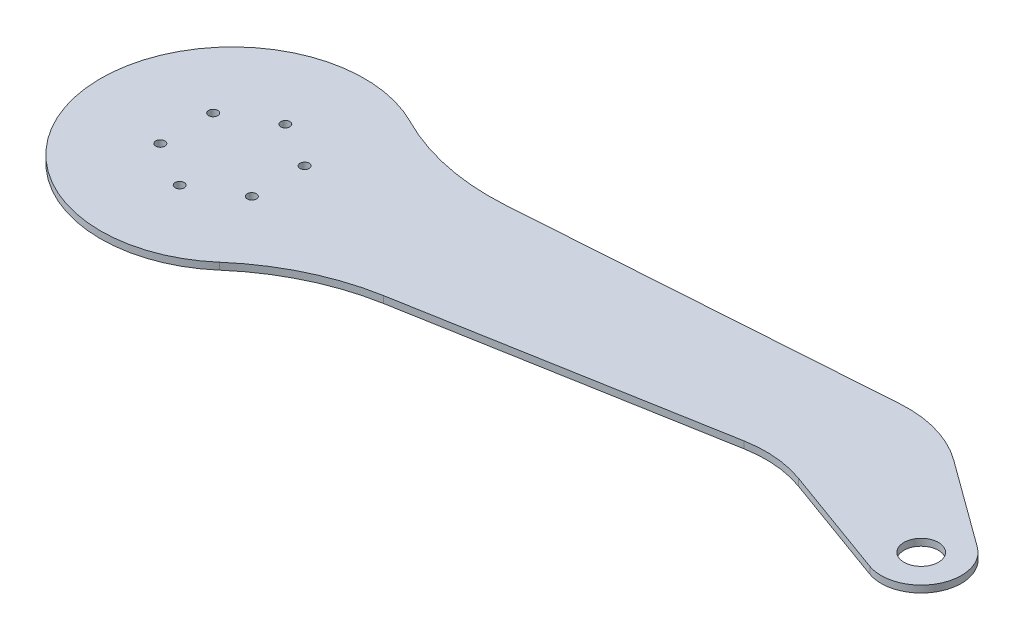
ISO-10303-21;
HEADER;
FILE_DESCRIPTION(('STEP AP214'),'2;1');
FILE_NAME('part.step','',(''),(''),'','','');
FILE_SCHEMA(('AUTOMOTIVE_DESIGN { 1 0 10303 214 1 1 1 1 }'));
ENDSEC;
DATA;
#1=APPLICATION_CONTEXT('core data for automotive mechanical design processes');
#2=APPLICATION_PROTOCOL_DEFINITION('international standard','automotive_design',2000,#1);
#3=PRODUCT_CONTEXT('',#1,'mechanical');
#4=PRODUCT('Part','Part','',(#3));
#5=PRODUCT_RELATED_PRODUCT_CATEGORY('part','',(#4));
#6=PRODUCT_DEFINITION_FORMATION('','',#4);
#7=PRODUCT_DEFINITION_CONTEXT('part definition',#1,'design');
#8=PRODUCT_DEFINITION('design','',#6,#7);
#9=PRODUCT_DEFINITION_SHAPE('','',#8);
#10=(LENGTH_UNIT() NAMED_UNIT(*) SI_UNIT(.MILLI.,.METRE.));
#11=(NAMED_UNIT(*) PLANE_ANGLE_UNIT() SI_UNIT($,.RADIAN.));
#12=(NAMED_UNIT(*) SI_UNIT($,.STERADIAN.) SOLID_ANGLE_UNIT());
#13=UNCERTAINTY_MEASURE_WITH_UNIT(LENGTH_MEASURE(1.E-05),#10,'distance_accuracy_value','');
#14=(GEOMETRIC_REPRESENTATION_CONTEXT(3) GLOBAL_UNCERTAINTY_ASSIGNED_CONTEXT((#13)) GLOBAL_UNIT_ASSIGNED_CONTEXT((#10,
#11,#12)) REPRESENTATION_CONTEXT('',''));
#15=CARTESIAN_POINT('',(0.,0.,0.));
#16=DIRECTION('',(0.,0.,1.));
#17=DIRECTION('',(1.,0.,0.));
#18=AXIS2_PLACEMENT_3D('',#15,#16,#17);
#19=CARTESIAN_POINT('',(28.8662620660002,3.,-79.6494584805988));
#20=DIRECTION('',(-0.340729771025605,0.,0.940161275067655));
#21=DIRECTION('',(0.940161275067655,0.,0.340729771025605));
#22=AXIS2_PLACEMENT_3D('',#19,#20,#21);
#23=PLANE('',#22);
#24=DIRECTION('',(-0.940161275067655,0.,-0.340729771025605));
#25=VECTOR('',#24,1.);
#26=CARTESIAN_POINT('',(28.8662620660002,3.,-79.6494584805988));
#27=LINE('',#26,#25);
#28=CARTESIAN_POINT('',(294.037229007052,3.,16.4528223136839));
#29=VERTEX_POINT('',#28);
#30=CARTESIAN_POINT('',(245.23023292495,3.,-1.23562863671853));
#31=VERTEX_POINT('',#30);
#32=EDGE_CURVE('E113',#29,#31,#27,.T.);
#33=ORIENTED_EDGE('',*,*,#32,.T.);
#34=DIRECTION('',(0.,-1.,0.));
#35=VECTOR('',#34,1.);
#36=CARTESIAN_POINT('',(245.23023292495,0.,-1.2356286367185));
#37=LINE('',#36,#35);
#38=CARTESIAN_POINT('',(245.23023292495,0.,-1.23562863671853));
#39=VERTEX_POINT('',#38);
#40=EDGE_CURVE('E213',#31,#39,#37,.T.);
#41=ORIENTED_EDGE('',*,*,#40,.T.);
#42=DIRECTION('',(-0.940161275067655,0.,-0.340729771025605));
#43=VECTOR('',#42,1.);
#44=CARTESIAN_POINT('',(28.8662620660002,0.,-79.6494584805988));
#45=LINE('',#44,#43);
#46=CARTESIAN_POINT('',(294.037229007052,0.,16.4528223136839));
#47=VERTEX_POINT('',#46);
#48=EDGE_CURVE('E116',#47,#39,#45,.T.);
#49=ORIENTED_EDGE('',*,*,#48,.F.);
#50=DIRECTION('',(0.,-1.,0.));
#51=VECTOR('',#50,1.);
#52=CARTESIAN_POINT('',(294.037229007052,3.,16.4528223136839));
#53=LINE('',#52,#51);
#54=EDGE_CURVE('E109',#29,#47,#53,.T.);
#55=ORIENTED_EDGE('',*,*,#54,.F.);
#56=EDGE_LOOP('',(#33,#41,#49,#55));
#57=FACE_BOUND('',#56,.T.);
#58=ADVANCED_FACE('F34',(#57),#23,.T.);
#59=CARTESIAN_POINT('',(300.,3.,0.));
#60=DIRECTION('',(0.,-1.,0.));
#61=DIRECTION('',(0.,0.,-1.));
#62=AXIS2_PLACEMENT_3D('',#59,#60,#61);
#63=CYLINDRICAL_SURFACE('',#62,17.5);
#64=CARTESIAN_POINT('',(300.,0.,0.));
#65=DIRECTION('',(0.,1.,0.));
#66=DIRECTION('',(0.,0.,1.));
#67=AXIS2_PLACEMENT_3D('',#64,#65,#66);
#68=CIRCLE('',#67,17.5);
#69=CARTESIAN_POINT('',(310.311776158135,0.,-14.1392104611441));
#70=VERTEX_POINT('',#69);
#71=EDGE_CURVE('E173',#47,#70,#68,.T.);
#72=ORIENTED_EDGE('',*,*,#71,.T.);
#73=DIRECTION('',(0.,-1.,0.));
#74=VECTOR('',#73,1.);
#75=CARTESIAN_POINT('',(310.311776158135,3.,-14.1392104611441));
#76=LINE('',#75,#74);
#77=CARTESIAN_POINT('',(310.311776158135,3.,-14.1392104611441));
#78=VERTEX_POINT('',#77);
#79=EDGE_CURVE('E120',#78,#70,#76,.T.);
#80=ORIENTED_EDGE('',*,*,#79,.F.);
#81=CARTESIAN_POINT('',(300.,3.,0.));
#82=DIRECTION('',(0.,1.,0.));
#83=DIRECTION('',(0.,0.,1.));
#84=AXIS2_PLACEMENT_3D('',#81,#82,#83);
#85=CIRCLE('',#84,17.5);
#86=EDGE_CURVE('E123',#29,#78,#85,.T.);
#87=ORIENTED_EDGE('',*,*,#86,.F.);
#88=ORIENTED_EDGE('',*,*,#54,.T.);
#89=EDGE_LOOP('',(#72,#80,#87,#88));
#90=FACE_BOUND('',#89,.T.);
#91=ADVANCED_FACE('F124',(#90),#63,.T.);
#92=CARTESIAN_POINT('',(114.474448029618,3.,-156.964065966195));
#93=DIRECTION('',(-0.589244351893404,0.,0.80795488349395));
#94=DIRECTION('',(0.80795488349395,0.,0.589244351893404));
#95=AXIS2_PLACEMENT_3D('',#92,#93,#94);
#96=PLANE('',#95);
#97=DIRECTION('',(-0.80795488349395,0.,-0.589244351893404));
#98=VECTOR('',#97,1.);
#99=CARTESIAN_POINT('',(114.474448029618,0.,-156.964065966195));
#100=LINE('',#99,#98);
#101=CARTESIAN_POINT('',(272.247100749326,0.,-41.8999127596457));
#102=VERTEX_POINT('',#101);
#103=EDGE_CURVE('E175',#70,#102,#100,.T.);
#104=ORIENTED_EDGE('',*,*,#103,.T.);
#105=DIRECTION('',(0.,-1.,0.));
#106=VECTOR('',#105,1.);
#107=CARTESIAN_POINT('',(272.247100749326,3.,-41.8999127596458));
#108=LINE('',#107,#106);
#109=CARTESIAN_POINT('',(272.247100749326,3.,-41.8999127596457));
#110=VERTEX_POINT('',#109);
#111=EDGE_CURVE('E208',#102,#110,#108,.F.);
#112=ORIENTED_EDGE('',*,*,#111,.T.);
#113=DIRECTION('',(-0.80795488349395,0.,-0.589244351893404));
#114=VECTOR('',#113,1.);
#115=CARTESIAN_POINT('',(114.474448029618,3.,-156.964065966195));
#116=LINE('',#115,#114);
#117=EDGE_CURVE('E129',#78,#110,#116,.T.);
#118=ORIENTED_EDGE('',*,*,#117,.F.);
#119=ORIENTED_EDGE('',*,*,#79,.T.);
#120=EDGE_LOOP('',(#104,#112,#118,#119));
#121=FACE_BOUND('',#120,.T.);
#122=ADVANCED_FACE('F258',(#121),#96,.F.);
#123=CARTESIAN_POINT('',(-2.37846094109579,3.,-34.9190911043183));
#124=DIRECTION('',(-0.0679560268884512,0.,-0.997688317266237));
#125=DIRECTION('',(-0.997688317266237,0.,0.0679560268884512));
#126=AXIS2_PLACEMENT_3D('',#123,#124,#125);
#127=PLANE('',#126);
#128=DIRECTION('',(0.997688317266237,0.,-0.0679560268884512));
#129=VECTOR('',#128,1.);
#130=CARTESIAN_POINT('',(-2.37846094109579,0.,-34.9190911043183));
#131=LINE('',#130,#129);
#132=CARTESIAN_POINT('',(78.5589077176873,0.,-40.4320172413385));
#133=VERTEX_POINT('',#132);
#134=CARTESIAN_POINT('',(239.387081810233,0.,-51.3865844482602));
#135=VERTEX_POINT('',#134);
#136=EDGE_CURVE('E178',#133,#135,#131,.T.);
#137=ORIENTED_EDGE('',*,*,#136,.F.);
#138=DIRECTION('',(0.,-1.,0.));
#139=VECTOR('',#138,1.);
#140=CARTESIAN_POINT('',(78.5589077176873,3.,-40.4320172413385));
#141=LINE('',#140,#139);
#142=CARTESIAN_POINT('',(78.5589077176873,3.,-40.4320172413385));
#143=VERTEX_POINT('',#142);
#144=EDGE_CURVE('E55',#133,#143,#141,.F.);
#145=ORIENTED_EDGE('',*,*,#144,.T.);
#146=DIRECTION('',(0.997688317266237,0.,-0.0679560268884512));
#147=VECTOR('',#146,1.);
#148=CARTESIAN_POINT('',(-2.37846094109579,3.,-34.9190911043183));
#149=LINE('',#148,#147);
#150=CARTESIAN_POINT('',(239.387081810233,3.,-51.3865844482602));
#151=VERTEX_POINT('',#150);
#152=EDGE_CURVE('E143',#143,#151,#149,.T.);
#153=ORIENTED_EDGE('',*,*,#152,.T.);
#154=DIRECTION('',(0.,-1.,0.));
#155=VECTOR('',#154,1.);
#156=CARTESIAN_POINT('',(239.387081810233,0.,-51.3865844482602));
#157=LINE('',#156,#155);
#158=EDGE_CURVE('E119',#151,#135,#157,.T.);
#159=ORIENTED_EDGE('',*,*,#158,.T.);
#160=EDGE_LOOP('',(#137,#145,#153,#159));
#161=FACE_BOUND('',#160,.T.);
#162=ADVANCED_FACE('F251',(#161),#127,.T.);
#163=CARTESIAN_POINT('',(0.,3.,0.));
#164=DIRECTION('',(0.,-1.,0.));
#165=DIRECTION('',(0.,0.,-1.));
#166=AXIS2_PLACEMENT_3D('',#163,#164,#165);
#167=CYLINDRICAL_SURFACE('',#166,57.5);
#168=CARTESIAN_POINT('',(0.,0.,0.));
#169=DIRECTION('',(0.,1.,0.));
#170=DIRECTION('',(0.,0.,1.));
#171=AXIS2_PLACEMENT_3D('',#168,#169,#170);
#172=CIRCLE('',#171,57.5);
#173=CARTESIAN_POINT('',(26.1993018359265,0.,-51.1844369248116));
#174=VERTEX_POINT('',#173);
#175=CARTESIAN_POINT('',(37.7849911882178,0.,43.3421785436116));
#176=VERTEX_POINT('',#175);
#177=EDGE_CURVE('E180',#174,#176,#172,.T.);
#178=ORIENTED_EDGE('',*,*,#177,.T.);
#179=DIRECTION('',(0.,-1.,0.));
#180=VECTOR('',#179,1.);
#181=CARTESIAN_POINT('',(37.7849911882178,3.,43.3421785436116));
#182=LINE('',#181,#180);
#183=CARTESIAN_POINT('',(37.7849911882178,3.,43.3421785436116));
#184=VERTEX_POINT('',#183);
#185=EDGE_CURVE('E226',#176,#184,#182,.F.);
#186=ORIENTED_EDGE('',*,*,#185,.T.);
#187=CARTESIAN_POINT('',(0.,3.,0.));
#188=DIRECTION('',(0.,1.,0.));
#189=DIRECTION('',(0.,0.,1.));
#190=AXIS2_PLACEMENT_3D('',#187,#188,#189);
#191=CIRCLE('',#190,57.5);
#192=CARTESIAN_POINT('',(26.1993018359265,3.,-51.1844369248116));
#193=VERTEX_POINT('',#192);
#194=EDGE_CURVE('E145',#193,#184,#191,.T.);
#195=ORIENTED_EDGE('',*,*,#194,.F.);
#196=DIRECTION('',(0.,-1.,0.));
#197=VECTOR('',#196,1.);
#198=CARTESIAN_POINT('',(26.1993018359265,3.,-51.1844369248116));
#199=LINE('',#198,#197);
#200=EDGE_CURVE('E223',#193,#174,#199,.T.);
#201=ORIENTED_EDGE('',*,*,#200,.T.);
#202=EDGE_LOOP('',(#178,#186,#195,#201));
#203=FACE_BOUND('',#202,.T.);
#204=ADVANCED_FACE('F245',(#203),#167,.T.);
#205=CARTESIAN_POINT('',(-19.9185842870416,3.,-11.4999999999991));
#206=DIRECTION('',(0.,-1.,0.));
#207=DIRECTION('',(0.,0.,-1.));
#208=AXIS2_PLACEMENT_3D('',#205,#206,#207);
#209=CYLINDRICAL_SURFACE('',#208,2.);
#210=CARTESIAN_POINT('',(-19.9185842870416,3.,-11.4999999999991));
#211=DIRECTION('',(0.,1.,0.));
#212=DIRECTION('',(0.,0.,1.));
#213=AXIS2_PLACEMENT_3D('',#210,#211,#212);
#214=CIRCLE('',#213,2.);
#215=CARTESIAN_POINT('',(-19.9185842870416,3.,-9.49999999999914));
#216=VERTEX_POINT('',#215);
#217=EDGE_CURVE('E166',#216,#216,#214,.T.);
#218=ORIENTED_EDGE('',*,*,#217,.T.);
#219=EDGE_LOOP('',(#218));
#220=FACE_BOUND('',#219,.T.);
#221=CARTESIAN_POINT('',(-19.9185842870416,0.,-11.4999999999991));
#222=DIRECTION('',(0.,1.,0.));
#223=DIRECTION('',(0.,0.,1.));
#224=AXIS2_PLACEMENT_3D('',#221,#222,#223);
#225=CIRCLE('',#224,2.);
#226=CARTESIAN_POINT('',(-19.9185842870416,0.,-9.49999999999914));
#227=VERTEX_POINT('',#226);
#228=EDGE_CURVE('E139',#227,#227,#225,.T.);
#229=ORIENTED_EDGE('',*,*,#228,.F.);
#230=EDGE_LOOP('',(#229));
#231=FACE_BOUND('',#230,.T.);
#232=ADVANCED_FACE('F331',(#220,#231),#209,.F.);
#233=CARTESIAN_POINT('',(-19.9185842870421,3.,11.5));
#234=DIRECTION('',(0.,-1.,0.));
#235=DIRECTION('',(0.,0.,-1.));
#236=AXIS2_PLACEMENT_3D('',#233,#234,#235);
#237=CYLINDRICAL_SURFACE('',#236,2.00000000000115);
#238=CARTESIAN_POINT('',(-19.9185842870421,3.,11.5));
#239=DIRECTION('',(0.,1.,0.));
#240=DIRECTION('',(0.,0.,1.));
#241=AXIS2_PLACEMENT_3D('',#238,#239,#240);
#242=CIRCLE('',#241,2.00000000000115);
#243=CARTESIAN_POINT('',(-19.9185842870421,3.,13.5000000000012));
#244=VERTEX_POINT('',#243);
#245=EDGE_CURVE('E163',#244,#244,#242,.T.);
#246=ORIENTED_EDGE('',*,*,#245,.T.);
#247=EDGE_LOOP('',(#246));
#248=FACE_BOUND('',#247,.T.);
#249=CARTESIAN_POINT('',(-19.9185842870421,0.,11.5));
#250=DIRECTION('',(0.,1.,0.));
#251=DIRECTION('',(0.,0.,1.));
#252=AXIS2_PLACEMENT_3D('',#249,#250,#251);
#253=CIRCLE('',#252,2.00000000000115);
#254=CARTESIAN_POINT('',(-19.9185842870421,0.,13.5000000000012));
#255=VERTEX_POINT('',#254);
#256=EDGE_CURVE('E198',#255,#255,#253,.T.);
#257=ORIENTED_EDGE('',*,*,#256,.F.);
#258=EDGE_LOOP('',(#257));
#259=FACE_BOUND('',#258,.T.);
#260=ADVANCED_FACE('F403',(#248,#259),#237,.F.);
#261=CARTESIAN_POINT('',(1.95264788778376E-12,3.,23.));
#262=DIRECTION('',(0.,-1.,0.));
#263=DIRECTION('',(0.,0.,-1.));
#264=AXIS2_PLACEMENT_3D('',#261,#262,#263);
#265=CYLINDRICAL_SURFACE('',#264,2.);
#266=CARTESIAN_POINT('',(1.95264788778376E-12,3.,23.));
#267=DIRECTION('',(0.,1.,0.));
#268=DIRECTION('',(0.,0.,1.));
#269=AXIS2_PLACEMENT_3D('',#266,#267,#268);
#270=CIRCLE('',#269,2.);
#271=CARTESIAN_POINT('',(1.95264788778376E-12,3.,25.));
#272=VERTEX_POINT('',#271);
#273=EDGE_CURVE('E160',#272,#272,#270,.T.);
#274=ORIENTED_EDGE('',*,*,#273,.T.);
#275=EDGE_LOOP('',(#274));
#276=FACE_BOUND('',#275,.T.);
#277=CARTESIAN_POINT('',(1.95264788778376E-12,0.,23.));
#278=DIRECTION('',(0.,1.,0.));
#279=DIRECTION('',(0.,0.,1.));
#280=AXIS2_PLACEMENT_3D('',#277,#278,#279);
#281=CIRCLE('',#280,2.);
#282=CARTESIAN_POINT('',(1.95264788778376E-12,0.,25.));
#283=VERTEX_POINT('',#282);
#284=EDGE_CURVE('E195',#283,#283,#281,.T.);
#285=ORIENTED_EDGE('',*,*,#284,.F.);
#286=EDGE_LOOP('',(#285));
#287=FACE_BOUND('',#286,.T.);
#288=ADVANCED_FACE('F393',(#276,#287),#265,.F.);
#289=CARTESIAN_POINT('',(19.9185842870436,3.,11.4999999999992));
#290=DIRECTION('',(0.,-1.,0.));
#291=DIRECTION('',(0.,0.,-1.));
#292=AXIS2_PLACEMENT_3D('',#289,#290,#291);
#293=CYLINDRICAL_SURFACE('',#292,2.);
#294=CARTESIAN_POINT('',(19.9185842870436,3.,11.4999999999992));
#295=DIRECTION('',(0.,1.,0.));
#296=DIRECTION('',(0.,0.,1.));
#297=AXIS2_PLACEMENT_3D('',#294,#295,#296);
#298=CIRCLE('',#297,2.);
#299=CARTESIAN_POINT('',(19.9185842870436,3.,13.4999999999992));
#300=VERTEX_POINT('',#299);
#301=EDGE_CURVE('E157',#300,#300,#298,.T.);
#302=ORIENTED_EDGE('',*,*,#301,.T.);
#303=EDGE_LOOP('',(#302));
#304=FACE_BOUND('',#303,.T.);
#305=CARTESIAN_POINT('',(19.9185842870436,0.,11.4999999999992));
#306=DIRECTION('',(0.,1.,0.));
#307=DIRECTION('',(0.,0.,1.));
#308=AXIS2_PLACEMENT_3D('',#305,#306,#307);
#309=CIRCLE('',#308,2.);
#310=CARTESIAN_POINT('',(19.9185842870436,0.,13.4999999999992));
#311=VERTEX_POINT('',#310);
#312=EDGE_CURVE('E192',#311,#311,#309,.T.);
#313=ORIENTED_EDGE('',*,*,#312,.F.);
#314=EDGE_LOOP('',(#313));
#315=FACE_BOUND('',#314,.T.);
#316=ADVANCED_FACE('F383',(#304,#315),#293,.F.);
#317=CARTESIAN_POINT('',(19.9185842870426,3.,-11.5000000000008));
#318=DIRECTION('',(0.,-1.,0.));
#319=DIRECTION('',(0.,0.,-1.));
#320=AXIS2_PLACEMENT_3D('',#317,#318,#319);
#321=CYLINDRICAL_SURFACE('',#320,2.);
#322=CARTESIAN_POINT('',(19.9185842870426,3.,-11.5000000000008));
#323=DIRECTION('',(0.,1.,0.));
#324=DIRECTION('',(0.,0.,1.));
#325=AXIS2_PLACEMENT_3D('',#322,#323,#324);
#326=CIRCLE('',#325,2.);
#327=CARTESIAN_POINT('',(19.9185842870426,3.,-9.50000000000085));
#328=VERTEX_POINT('',#327);
#329=EDGE_CURVE('E154',#328,#328,#326,.T.);
#330=ORIENTED_EDGE('',*,*,#329,.T.);
#331=EDGE_LOOP('',(#330));
#332=FACE_BOUND('',#331,.T.);
#333=CARTESIAN_POINT('',(19.9185842870426,0.,-11.5000000000008));
#334=DIRECTION('',(0.,1.,0.));
#335=DIRECTION('',(0.,0.,1.));
#336=AXIS2_PLACEMENT_3D('',#333,#334,#335);
#337=CIRCLE('',#336,2.);
#338=CARTESIAN_POINT('',(19.9185842870426,0.,-9.50000000000085));
#339=VERTEX_POINT('',#338);
#340=EDGE_CURVE('E189',#339,#339,#337,.T.);
#341=ORIENTED_EDGE('',*,*,#340,.F.);
#342=EDGE_LOOP('',(#341));
#343=FACE_BOUND('',#342,.T.);
#344=ADVANCED_FACE('F373',(#332,#343),#321,.F.);
#345=CARTESIAN_POINT('',(0.,3.,-23.));
#346=DIRECTION('',(0.,-1.,0.));
#347=DIRECTION('',(0.,0.,-1.));
#348=AXIS2_PLACEMENT_3D('',#345,#346,#347);
#349=CYLINDRICAL_SURFACE('',#348,2.);
#350=CARTESIAN_POINT('',(0.,3.,-23.));
#351=DIRECTION('',(0.,1.,0.));
#352=DIRECTION('',(0.,0.,1.));
#353=AXIS2_PLACEMENT_3D('',#350,#351,#352);
#354=CIRCLE('',#353,2.);
#355=CARTESIAN_POINT('',(0.,3.,-21.));
#356=VERTEX_POINT('',#355);
#357=EDGE_CURVE('E151',#356,#356,#354,.T.);
#358=ORIENTED_EDGE('',*,*,#357,.T.);
#359=EDGE_LOOP('',(#358));
#360=FACE_BOUND('',#359,.T.);
#361=CARTESIAN_POINT('',(0.,0.,-23.));
#362=DIRECTION('',(0.,1.,0.));
#363=DIRECTION('',(0.,0.,1.));
#364=AXIS2_PLACEMENT_3D('',#361,#362,#363);
#365=CIRCLE('',#364,2.);
#366=CARTESIAN_POINT('',(0.,0.,-21.));
#367=VERTEX_POINT('',#366);
#368=EDGE_CURVE('E186',#367,#367,#365,.T.);
#369=ORIENTED_EDGE('',*,*,#368,.F.);
#370=EDGE_LOOP('',(#369));
#371=FACE_BOUND('',#370,.T.);
#372=ADVANCED_FACE('F319',(#360,#371),#349,.F.);
#373=CARTESIAN_POINT('',(6.12500000000001,3.,34.4598951681517));
#374=DIRECTION('',(0.175,0.,0.984568433375761));
#375=DIRECTION('',(0.984568433375761,0.,-0.175));
#376=AXIS2_PLACEMENT_3D('',#373,#374,#375);
#377=PLANE('',#376);
#378=DIRECTION('',(-0.984568433375761,0.,0.175));
#379=VECTOR('',#378,1.);
#380=CARTESIAN_POINT('',(6.12500000000001,3.,34.4598951681517));
#381=LINE('',#380,#379);
#382=CARTESIAN_POINT('',(219.44374437367,3.,-3.45598655212381));
#383=VERTEX_POINT('',#382);
#384=CARTESIAN_POINT('',(85.9980193416399,3.,20.2630370210122));
#385=VERTEX_POINT('',#384);
#386=EDGE_CURVE('E148',#383,#385,#381,.T.);
#387=ORIENTED_EDGE('',*,*,#386,.T.);
#388=DIRECTION('',(0.,-1.,0.));
#389=VECTOR('',#388,1.);
#390=CARTESIAN_POINT('',(85.9980193416399,3.,20.2630370210122));
#391=LINE('',#390,#389);
#392=CARTESIAN_POINT('',(85.9980193416399,0.,20.2630370210122));
#393=VERTEX_POINT('',#392);
#394=EDGE_CURVE('E220',#385,#393,#391,.T.);
#395=ORIENTED_EDGE('',*,*,#394,.T.);
#396=DIRECTION('',(-0.984568433375761,0.,0.175));
#397=VECTOR('',#396,1.);
#398=CARTESIAN_POINT('',(6.12500000000001,0.,34.4598951681517));
#399=LINE('',#398,#397);
#400=CARTESIAN_POINT('',(219.44374437367,0.,-3.45598655212381));
#401=VERTEX_POINT('',#400);
#402=EDGE_CURVE('E183',#401,#393,#399,.T.);
#403=ORIENTED_EDGE('',*,*,#402,.F.);
#404=DIRECTION('',(0.,-1.,0.));
#405=VECTOR('',#404,1.);
#406=CARTESIAN_POINT('',(219.44374437367,3.,-3.45598655212382));
#407=LINE('',#406,#405);
#408=EDGE_CURVE('E215',#401,#383,#407,.F.);
#409=ORIENTED_EDGE('',*,*,#408,.T.);
#410=EDGE_LOOP('',(#387,#395,#403,#409));
#411=FACE_BOUND('',#410,.T.);
#412=ADVANCED_FACE('F238',(#411),#377,.T.);
#413=CARTESIAN_POINT('',(300.,3.,0.));
#414=DIRECTION('',(0.,-1.,0.));
#415=DIRECTION('',(0.,0.,-1.));
#416=AXIS2_PLACEMENT_3D('',#413,#414,#415);
#417=CYLINDRICAL_SURFACE('',#416,7.50000000000001);
#418=CARTESIAN_POINT('',(300.,3.,0.));
#419=DIRECTION('',(0.,1.,0.));
#420=DIRECTION('',(0.,0.,1.));
#421=AXIS2_PLACEMENT_3D('',#418,#419,#420);
#422=CIRCLE('',#421,7.50000000000001);
#423=CARTESIAN_POINT('',(300.,3.,7.50000000000001));
#424=VERTEX_POINT('',#423);
#425=EDGE_CURVE('E169',#424,#424,#422,.T.);
#426=ORIENTED_EDGE('',*,*,#425,.T.);
#427=EDGE_LOOP('',(#426));
#428=FACE_BOUND('',#427,.T.);
#429=CARTESIAN_POINT('',(300.,0.,0.));
#430=DIRECTION('',(0.,1.,0.));
#431=DIRECTION('',(0.,0.,1.));
#432=AXIS2_PLACEMENT_3D('',#429,#430,#431);
#433=CIRCLE('',#432,7.50000000000001);
#434=CARTESIAN_POINT('',(300.,0.,7.50000000000001));
#435=VERTEX_POINT('',#434);
#436=EDGE_CURVE('E136',#435,#435,#433,.T.);
#437=ORIENTED_EDGE('',*,*,#436,.F.);
#438=EDGE_LOOP('',(#437));
#439=FACE_BOUND('',#438,.T.);
#440=ADVANCED_FACE('F307',(#428,#439),#417,.F.);
#441=CARTESIAN_POINT('',(0.,3.,0.));
#442=DIRECTION('',(0.,1.,0.));
#443=DIRECTION('',(0.,0.,1.));
#444=AXIS2_PLACEMENT_3D('',#441,#442,#443);
#445=PLANE('',#444);
#446=ORIENTED_EDGE('',*,*,#117,.T.);
#447=CARTESIAN_POINT('',(242.784883154656,3.,-1.5021685849483));
#448=DIRECTION('',(0.,1.,0.));
#449=DIRECTION('',(0.,0.,1.));
#450=AXIS2_PLACEMENT_3D('',#447,#448,#449);
#451=CIRCLE('',#450,50.);
#452=EDGE_CURVE('E210',#110,#151,#451,.T.);
#453=ORIENTED_EDGE('',*,*,#452,.T.);
#454=ORIENTED_EDGE('',*,*,#152,.F.);
#455=CARTESIAN_POINT('',(71.7633050288422,3.,-140.200848967962));
#456=DIRECTION('',(0.,1.,0.));
#457=DIRECTION('',(0.,0.,1.));
#458=AXIS2_PLACEMENT_3D('',#455,#456,#457);
#459=CIRCLE('',#458,100.);
#460=EDGE_CURVE('E11',#143,#193,#459,.F.);
#461=ORIENTED_EDGE('',*,*,#460,.T.);
#462=ORIENTED_EDGE('',*,*,#194,.T.);
#463=CARTESIAN_POINT('',(103.49801934164,3.,118.719880358588));
#464=DIRECTION('',(0.,1.,0.));
#465=DIRECTION('',(0.,0.,1.));
#466=AXIS2_PLACEMENT_3D('',#463,#464,#465);
#467=CIRCLE('',#466,100.);
#468=EDGE_CURVE('E231',#184,#385,#467,.F.);
#469=ORIENTED_EDGE('',*,*,#468,.T.);
#470=ORIENTED_EDGE('',*,*,#386,.F.);
#471=CARTESIAN_POINT('',(228.19374437367,3.,45.7724351166642));
#472=DIRECTION('',(0.,1.,0.));
#473=DIRECTION('',(0.,0.,1.));
#474=AXIS2_PLACEMENT_3D('',#471,#472,#473);
#475=CIRCLE('',#474,50.);
#476=EDGE_CURVE('E135',#383,#31,#475,.F.);
#477=ORIENTED_EDGE('',*,*,#476,.T.);
#478=ORIENTED_EDGE('',*,*,#32,.F.);
#479=ORIENTED_EDGE('',*,*,#86,.T.);
#480=EDGE_LOOP('',(#446,#453,#454,#461,#462,#469,#470,#477,#478,#479));
#481=FACE_BOUND('',#480,.T.);
#482=ORIENTED_EDGE('',*,*,#357,.F.);
#483=EDGE_LOOP('',(#482));
#484=FACE_BOUND('',#483,.T.);
#485=ORIENTED_EDGE('',*,*,#329,.F.);
#486=EDGE_LOOP('',(#485));
#487=FACE_BOUND('',#486,.T.);
#488=ORIENTED_EDGE('',*,*,#301,.F.);
#489=EDGE_LOOP('',(#488));
#490=FACE_BOUND('',#489,.T.);
#491=ORIENTED_EDGE('',*,*,#273,.F.);
#492=EDGE_LOOP('',(#491));
#493=FACE_BOUND('',#492,.T.);
#494=ORIENTED_EDGE('',*,*,#245,.F.);
#495=EDGE_LOOP('',(#494));
#496=FACE_BOUND('',#495,.T.);
#497=ORIENTED_EDGE('',*,*,#217,.F.);
#498=EDGE_LOOP('',(#497));
#499=FACE_BOUND('',#498,.T.);
#500=ORIENTED_EDGE('',*,*,#425,.F.);
#501=EDGE_LOOP('',(#500));
#502=FACE_BOUND('',#501,.T.);
#503=ADVANCED_FACE('F131',(#481,#484,#487,#490,#493,#496,#499,#502),#445,.T.);
#504=CARTESIAN_POINT('',(0.,0.,0.));
#505=DIRECTION('',(0.,1.,0.));
#506=DIRECTION('',(0.,0.,1.));
#507=AXIS2_PLACEMENT_3D('',#504,#505,#506);
#508=PLANE('',#507);
#509=ORIENTED_EDGE('',*,*,#177,.F.);
#510=CARTESIAN_POINT('',(71.7633050288422,0.,-140.200848967962));
#511=DIRECTION('',(0.,1.,0.));
#512=DIRECTION('',(0.,0.,1.));
#513=AXIS2_PLACEMENT_3D('',#510,#511,#512);
#514=CIRCLE('',#513,100.);
#515=EDGE_CURVE('E42',#174,#133,#514,.T.);
#516=ORIENTED_EDGE('',*,*,#515,.T.);
#517=ORIENTED_EDGE('',*,*,#136,.T.);
#518=CARTESIAN_POINT('',(242.784883154656,0.,-1.5021685849483));
#519=DIRECTION('',(0.,1.,0.));
#520=DIRECTION('',(0.,0.,1.));
#521=AXIS2_PLACEMENT_3D('',#518,#519,#520);
#522=CIRCLE('',#521,50.);
#523=EDGE_CURVE('E206',#135,#102,#522,.F.);
#524=ORIENTED_EDGE('',*,*,#523,.T.);
#525=ORIENTED_EDGE('',*,*,#103,.F.);
#526=ORIENTED_EDGE('',*,*,#71,.F.);
#527=ORIENTED_EDGE('',*,*,#48,.T.);
#528=CARTESIAN_POINT('',(228.19374437367,0.,45.7724351166642));
#529=DIRECTION('',(0.,1.,0.));
#530=DIRECTION('',(0.,0.,1.));
#531=AXIS2_PLACEMENT_3D('',#528,#529,#530);
#532=CIRCLE('',#531,50.);
#533=EDGE_CURVE('E217',#39,#401,#532,.T.);
#534=ORIENTED_EDGE('',*,*,#533,.T.);
#535=ORIENTED_EDGE('',*,*,#402,.T.);
#536=CARTESIAN_POINT('',(103.49801934164,0.,118.719880358588));
#537=DIRECTION('',(0.,1.,0.));
#538=DIRECTION('',(0.,0.,1.));
#539=AXIS2_PLACEMENT_3D('',#536,#537,#538);
#540=CIRCLE('',#539,100.);
#541=EDGE_CURVE('E229',#393,#176,#540,.T.);
#542=ORIENTED_EDGE('',*,*,#541,.T.);
#543=EDGE_LOOP('',(#509,#516,#517,#524,#525,#526,#527,#534,#535,#542));
#544=FACE_BOUND('',#543,.T.);
#545=ORIENTED_EDGE('',*,*,#368,.T.);
#546=EDGE_LOOP('',(#545));
#547=FACE_BOUND('',#546,.T.);
#548=ORIENTED_EDGE('',*,*,#340,.T.);
#549=EDGE_LOOP('',(#548));
#550=FACE_BOUND('',#549,.T.);
#551=ORIENTED_EDGE('',*,*,#312,.T.);
#552=EDGE_LOOP('',(#551));
#553=FACE_BOUND('',#552,.T.);
#554=ORIENTED_EDGE('',*,*,#284,.T.);
#555=EDGE_LOOP('',(#554));
#556=FACE_BOUND('',#555,.T.);
#557=ORIENTED_EDGE('',*,*,#256,.T.);
#558=EDGE_LOOP('',(#557));
#559=FACE_BOUND('',#558,.T.);
#560=ORIENTED_EDGE('',*,*,#228,.T.);
#561=EDGE_LOOP('',(#560));
#562=FACE_BOUND('',#561,.T.);
#563=ORIENTED_EDGE('',*,*,#436,.T.);
#564=EDGE_LOOP('',(#563));
#565=FACE_BOUND('',#564,.T.);
#566=ADVANCED_FACE('F242',(#544,#547,#550,#553,#556,#559,#562,#565),#508,.F.);
#567=CARTESIAN_POINT('',(242.784883154656,3.,-1.5021685849483));
#568=DIRECTION('',(0.,1.,0.));
#569=DIRECTION('',(0.,0.,1.));
#570=AXIS2_PLACEMENT_3D('',#567,#568,#569);
#571=CYLINDRICAL_SURFACE('',#570,50.);
#572=ORIENTED_EDGE('',*,*,#452,.F.);
#573=ORIENTED_EDGE('',*,*,#111,.F.);
#574=ORIENTED_EDGE('',*,*,#523,.F.);
#575=ORIENTED_EDGE('',*,*,#158,.F.);
#576=EDGE_LOOP('',(#572,#573,#574,#575));
#577=FACE_BOUND('',#576,.T.);
#578=ADVANCED_FACE('F254',(#577),#571,.T.);
#579=CARTESIAN_POINT('',(228.19374437367,3.,45.7724351166642));
#580=DIRECTION('',(0.,1.,0.));
#581=DIRECTION('',(0.,0.,1.));
#582=AXIS2_PLACEMENT_3D('',#579,#580,#581);
#583=CYLINDRICAL_SURFACE('',#582,50.);
#584=ORIENTED_EDGE('',*,*,#476,.F.);
#585=ORIENTED_EDGE('',*,*,#408,.F.);
#586=ORIENTED_EDGE('',*,*,#533,.F.);
#587=ORIENTED_EDGE('',*,*,#40,.F.);
#588=EDGE_LOOP('',(#584,#585,#586,#587));
#589=FACE_BOUND('',#588,.T.);
#590=ADVANCED_FACE('F274',(#589),#583,.F.);
#591=CARTESIAN_POINT('',(103.49801934164,3.,118.719880358588));
#592=DIRECTION('',(0.,-1.,0.));
#593=DIRECTION('',(0.,0.,-1.));
#594=AXIS2_PLACEMENT_3D('',#591,#592,#593);
#595=CYLINDRICAL_SURFACE('',#594,100.);
#596=ORIENTED_EDGE('',*,*,#468,.F.);
#597=ORIENTED_EDGE('',*,*,#185,.F.);
#598=ORIENTED_EDGE('',*,*,#541,.F.);
#599=ORIENTED_EDGE('',*,*,#394,.F.);
#600=EDGE_LOOP('',(#596,#597,#598,#599));
#601=FACE_BOUND('',#600,.T.);
#602=ADVANCED_FACE('F241',(#601),#595,.F.);
#603=CARTESIAN_POINT('',(71.7633050288422,3.,-140.200848967962));
#604=DIRECTION('',(0.,-1.,0.));
#605=DIRECTION('',(0.,0.,-1.));
#606=AXIS2_PLACEMENT_3D('',#603,#604,#605);
#607=CYLINDRICAL_SURFACE('',#606,100.);
#608=ORIENTED_EDGE('',*,*,#460,.F.);
#609=ORIENTED_EDGE('',*,*,#144,.F.);
#610=ORIENTED_EDGE('',*,*,#515,.F.);
#611=ORIENTED_EDGE('',*,*,#200,.F.);
#612=EDGE_LOOP('',(#608,#609,#610,#611));
#613=FACE_BOUND('',#612,.T.);
#614=ADVANCED_FACE('F36',(#613),#607,.F.);
#615=CLOSED_SHELL('',(#58,#91,#122,#162,#204,#232,#260,#288,#316,#344,#372,#412,#440,#503,#566,
#578,#590,#602,#614));
#616=MANIFOLD_SOLID_BREP('B2',#615);
#617=ADVANCED_BREP_SHAPE_REPRESENTATION('',(#18,#616),#14);
#618=SHAPE_DEFINITION_REPRESENTATION(#9,#617);
ENDSEC;
END-ISO-10303-21;
